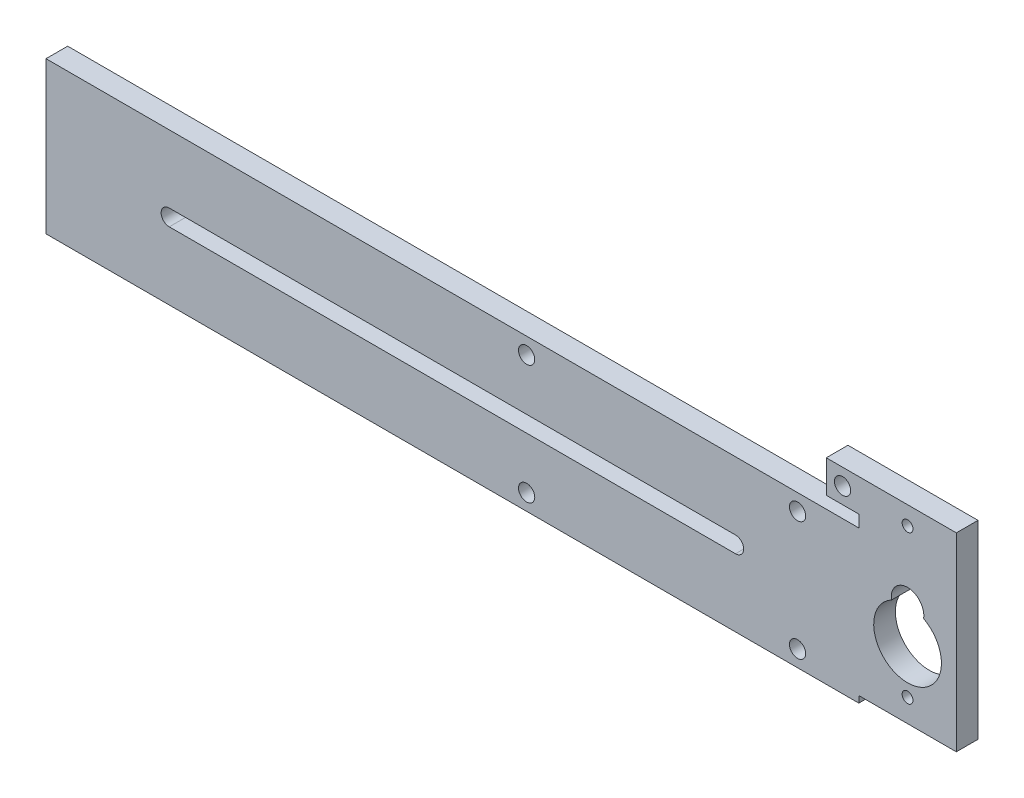
ISO-10303-21;
HEADER;
FILE_DESCRIPTION(('STEP AP214'),'2;1');
FILE_NAME('part.step','',(''),(''),'','','');
FILE_SCHEMA(('AUTOMOTIVE_DESIGN { 1 0 10303 214 1 1 1 1 }'));
ENDSEC;
DATA;
#1=APPLICATION_CONTEXT('core data for automotive mechanical design processes');
#2=APPLICATION_PROTOCOL_DEFINITION('international standard','automotive_design',2000,#1);
#3=PRODUCT_CONTEXT('',#1,'mechanical');
#4=PRODUCT('Part','Part','',(#3));
#5=PRODUCT_RELATED_PRODUCT_CATEGORY('part','',(#4));
#6=PRODUCT_DEFINITION_FORMATION('','',#4);
#7=PRODUCT_DEFINITION_CONTEXT('part definition',#1,'design');
#8=PRODUCT_DEFINITION('design','',#6,#7);
#9=PRODUCT_DEFINITION_SHAPE('','',#8);
#10=(LENGTH_UNIT() NAMED_UNIT(*) SI_UNIT(.MILLI.,.METRE.));
#11=(NAMED_UNIT(*) PLANE_ANGLE_UNIT() SI_UNIT($,.RADIAN.));
#12=(NAMED_UNIT(*) SI_UNIT($,.STERADIAN.) SOLID_ANGLE_UNIT());
#13=UNCERTAINTY_MEASURE_WITH_UNIT(LENGTH_MEASURE(1.E-05),#10,'distance_accuracy_value','');
#14=(GEOMETRIC_REPRESENTATION_CONTEXT(3) GLOBAL_UNCERTAINTY_ASSIGNED_CONTEXT((#13)) GLOBAL_UNIT_ASSIGNED_CONTEXT((#10,
#11,#12)) REPRESENTATION_CONTEXT('',''));
#15=CARTESIAN_POINT('',(0.,0.,0.));
#16=DIRECTION('',(0.,0.,1.));
#17=DIRECTION('',(1.,0.,0.));
#18=AXIS2_PLACEMENT_3D('',#15,#16,#17);
#19=CARTESIAN_POINT('',(-75.,14.,4.));
#20=DIRECTION('',(1.,0.,0.));
#21=DIRECTION('',(0.,0.,-1.));
#22=AXIS2_PLACEMENT_3D('',#19,#20,#21);
#23=PLANE('',#22);
#24=DIRECTION('',(0.,-1.,0.));
#25=VECTOR('',#24,1.);
#26=CARTESIAN_POINT('',(-75.,14.,0.));
#27=LINE('',#26,#25);
#28=CARTESIAN_POINT('',(-75.,14.,0.));
#29=VERTEX_POINT('',#28);
#30=CARTESIAN_POINT('',(-75.,-14.,0.));
#31=VERTEX_POINT('',#30);
#32=EDGE_CURVE('E315',#29,#31,#27,.T.);
#33=ORIENTED_EDGE('',*,*,#32,.T.);
#34=DIRECTION('',(0.,0.,-1.));
#35=VECTOR('',#34,1.);
#36=CARTESIAN_POINT('',(-75.,-14.,4.));
#37=LINE('',#36,#35);
#38=CARTESIAN_POINT('',(-75.,-14.,4.));
#39=VERTEX_POINT('',#38);
#40=EDGE_CURVE('E12',#39,#31,#37,.T.);
#41=ORIENTED_EDGE('',*,*,#40,.F.);
#42=DIRECTION('',(0.,-1.,0.));
#43=VECTOR('',#42,1.);
#44=CARTESIAN_POINT('',(-75.,14.,4.));
#45=LINE('',#44,#43);
#46=CARTESIAN_POINT('',(-75.,14.,4.));
#47=VERTEX_POINT('',#46);
#48=EDGE_CURVE('E296',#47,#39,#45,.T.);
#49=ORIENTED_EDGE('',*,*,#48,.F.);
#50=DIRECTION('',(0.,0.,-1.));
#51=VECTOR('',#50,1.);
#52=CARTESIAN_POINT('',(-75.,14.,4.));
#53=LINE('',#52,#51);
#54=EDGE_CURVE('E314',#47,#29,#53,.T.);
#55=ORIENTED_EDGE('',*,*,#54,.T.);
#56=EDGE_LOOP('',(#33,#41,#49,#55));
#57=FACE_BOUND('',#56,.T.);
#58=ADVANCED_FACE('F44',(#57),#23,.F.);
#59=CARTESIAN_POINT('',(-75.,-14.,4.));
#60=DIRECTION('',(0.,1.,0.));
#61=DIRECTION('',(0.,0.,1.));
#62=AXIS2_PLACEMENT_3D('',#59,#60,#61);
#63=PLANE('',#62);
#64=DIRECTION('',(1.,0.,0.));
#65=VECTOR('',#64,1.);
#66=CARTESIAN_POINT('',(-75.,-14.,0.));
#67=LINE('',#66,#65);
#68=CARTESIAN_POINT('',(75.,-14.,0.));
#69=VERTEX_POINT('',#68);
#70=EDGE_CURVE('E318',#31,#69,#67,.T.);
#71=ORIENTED_EDGE('',*,*,#70,.T.);
#72=DIRECTION('',(0.,0.,-1.));
#73=VECTOR('',#72,1.);
#74=CARTESIAN_POINT('',(75.,-14.,4.));
#75=LINE('',#74,#73);
#76=CARTESIAN_POINT('',(75.,-14.,4.));
#77=VERTEX_POINT('',#76);
#78=EDGE_CURVE('E51',#77,#69,#75,.T.);
#79=ORIENTED_EDGE('',*,*,#78,.F.);
#80=DIRECTION('',(1.,0.,0.));
#81=VECTOR('',#80,1.);
#82=CARTESIAN_POINT('',(-75.,-14.,4.));
#83=LINE('',#82,#81);
#84=EDGE_CURVE('E300',#39,#77,#83,.T.);
#85=ORIENTED_EDGE('',*,*,#84,.F.);
#86=ORIENTED_EDGE('',*,*,#40,.T.);
#87=EDGE_LOOP('',(#71,#79,#85,#86));
#88=FACE_BOUND('',#87,.T.);
#89=ADVANCED_FACE('F333',(#88),#63,.F.);
#90=CARTESIAN_POINT('',(75.,14.,4.));
#91=DIRECTION('',(1.,0.,0.));
#92=DIRECTION('',(0.,0.,-1.));
#93=AXIS2_PLACEMENT_3D('',#90,#91,#92);
#94=PLANE('',#93);
#95=DIRECTION('',(0.,0.,-1.));
#96=VECTOR('',#95,1.);
#97=CARTESIAN_POINT('',(75.,-12.7852836570863,43.3573373083089));
#98=LINE('',#97,#96);
#99=CARTESIAN_POINT('',(75.,-12.7852836570863,4.));
#100=VERTEX_POINT('',#99);
#101=CARTESIAN_POINT('',(75.,-12.7852836570863,0.));
#102=VERTEX_POINT('',#101);
#103=EDGE_CURVE('E66',#100,#102,#98,.T.);
#104=ORIENTED_EDGE('',*,*,#103,.F.);
#105=DIRECTION('',(0.,-1.,0.));
#106=VECTOR('',#105,1.);
#107=CARTESIAN_POINT('',(75.,14.,4.));
#108=LINE('',#107,#106);
#109=EDGE_CURVE('E306',#100,#77,#108,.T.);
#110=ORIENTED_EDGE('',*,*,#109,.T.);
#111=ORIENTED_EDGE('',*,*,#78,.T.);
#112=DIRECTION('',(0.,-1.,0.));
#113=VECTOR('',#112,1.);
#114=CARTESIAN_POINT('',(75.,14.,0.));
#115=LINE('',#114,#113);
#116=EDGE_CURVE('E322',#102,#69,#115,.T.);
#117=ORIENTED_EDGE('',*,*,#116,.F.);
#118=EDGE_LOOP('',(#104,#110,#111,#117));
#119=FACE_BOUND('',#118,.T.);
#120=ADVANCED_FACE('F331',(#119),#94,.T.);
#121=CARTESIAN_POINT('',(-75.,14.,4.));
#122=DIRECTION('',(0.,1.,0.));
#123=DIRECTION('',(0.,0.,1.));
#124=AXIS2_PLACEMENT_3D('',#121,#122,#123);
#125=PLANE('',#124);
#126=DIRECTION('',(1.,0.,0.));
#127=VECTOR('',#126,1.);
#128=CARTESIAN_POINT('',(-75.,14.,0.));
#129=LINE('',#128,#127);
#130=CARTESIAN_POINT('',(75.,14.,0.));
#131=VERTEX_POINT('',#130);
#132=EDGE_CURVE('E301',#29,#131,#129,.T.);
#133=ORIENTED_EDGE('',*,*,#132,.F.);
#134=ORIENTED_EDGE('',*,*,#54,.F.);
#135=DIRECTION('',(1.,0.,0.));
#136=VECTOR('',#135,1.);
#137=CARTESIAN_POINT('',(-75.,14.,4.));
#138=LINE('',#137,#136);
#139=CARTESIAN_POINT('',(75.,14.,4.));
#140=VERTEX_POINT('',#139);
#141=EDGE_CURVE('E309',#47,#140,#138,.T.);
#142=ORIENTED_EDGE('',*,*,#141,.T.);
#143=DIRECTION('',(0.,0.,-1.));
#144=VECTOR('',#143,1.);
#145=CARTESIAN_POINT('',(75.,14.,4.));
#146=LINE('',#145,#144);
#147=EDGE_CURVE('E327',#140,#131,#146,.T.);
#148=ORIENTED_EDGE('',*,*,#147,.T.);
#149=EDGE_LOOP('',(#133,#134,#142,#148));
#150=FACE_BOUND('',#149,.T.);
#151=ADVANCED_FACE('F390',(#150),#125,.T.);
#152=CARTESIAN_POINT('',(0.,0.,4.));
#153=DIRECTION('',(0.,0.,1.));
#154=DIRECTION('',(1.,0.,0.));
#155=AXIS2_PLACEMENT_3D('',#152,#153,#154);
#156=PLANE('',#155);
#157=CARTESIAN_POINT('',(13.6991032148638,11.0037655044453,4.));
#158=DIRECTION('',(0.,0.,1.));
#159=DIRECTION('',(-1.,0.,0.));
#160=AXIS2_PLACEMENT_3D('',#157,#158,#159);
#161=CIRCLE('',#160,1.5);
#162=CARTESIAN_POINT('',(12.1991032148638,11.0037655044453,4.));
#163=VERTEX_POINT('',#162);
#164=EDGE_CURVE('E621',#163,#163,#161,.T.);
#165=ORIENTED_EDGE('',*,*,#164,.F.);
#166=EDGE_LOOP('',(#165));
#167=FACE_BOUND('',#166,.T.);
#168=CARTESIAN_POINT('',(63.6991032148638,11.0037655044453,4.));
#169=DIRECTION('',(0.,0.,1.));
#170=DIRECTION('',(-1.,0.,0.));
#171=AXIS2_PLACEMENT_3D('',#168,#169,#170);
#172=CIRCLE('',#171,1.5);
#173=CARTESIAN_POINT('',(62.1991032148638,11.0037655044453,4.));
#174=VERTEX_POINT('',#173);
#175=EDGE_CURVE('E629',#174,#174,#172,.T.);
#176=ORIENTED_EDGE('',*,*,#175,.F.);
#177=EDGE_LOOP('',(#176));
#178=FACE_BOUND('',#177,.T.);
#179=CARTESIAN_POINT('',(63.6991032148638,-11.0037655044453,4.));
#180=DIRECTION('',(0.,0.,1.));
#181=DIRECTION('',(1.,0.,0.));
#182=AXIS2_PLACEMENT_3D('',#179,#180,#181);
#183=CIRCLE('',#182,1.5);
#184=CARTESIAN_POINT('',(65.1991032148638,-11.0037655044453,4.));
#185=VERTEX_POINT('',#184);
#186=EDGE_CURVE('E245',#185,#185,#183,.T.);
#187=ORIENTED_EDGE('',*,*,#186,.F.);
#188=EDGE_LOOP('',(#187));
#189=FACE_BOUND('',#188,.T.);
#190=CARTESIAN_POINT('',(13.6991032148638,-11.0037655044453,4.));
#191=DIRECTION('',(0.,0.,1.));
#192=DIRECTION('',(1.,0.,0.));
#193=AXIS2_PLACEMENT_3D('',#190,#191,#192);
#194=CIRCLE('',#193,1.5);
#195=CARTESIAN_POINT('',(15.1991032148638,-11.0037655044453,4.));
#196=VERTEX_POINT('',#195);
#197=EDGE_CURVE('E244',#196,#196,#194,.T.);
#198=ORIENTED_EDGE('',*,*,#197,.F.);
#199=EDGE_LOOP('',(#198));
#200=FACE_BOUND('',#199,.T.);
#201=CARTESIAN_POINT('',(-52.2515345705721,0.,4.));
#202=DIRECTION('',(0.,0.,1.));
#203=DIRECTION('',(1.,0.,0.));
#204=AXIS2_PLACEMENT_3D('',#201,#202,#203);
#205=CIRCLE('',#204,1.50000000000002);
#206=CARTESIAN_POINT('',(-52.2515345705721,1.50000000000002,4.));
#207=VERTEX_POINT('',#206);
#208=CARTESIAN_POINT('',(-52.2515345705721,-1.50000000000002,4.));
#209=VERTEX_POINT('',#208);
#210=EDGE_CURVE('E279',#207,#209,#205,.T.);
#211=ORIENTED_EDGE('',*,*,#210,.F.);
#212=DIRECTION('',(1.,0.,0.));
#213=VECTOR('',#212,1.);
#214=CARTESIAN_POINT('',(-52.2515345705721,1.50000000000002,4.));
#215=LINE('',#214,#213);
#216=CARTESIAN_POINT('',(52.2515345705721,1.50000000000002,4.));
#217=VERTEX_POINT('',#216);
#218=EDGE_CURVE('E271',#207,#217,#215,.T.);
#219=ORIENTED_EDGE('',*,*,#218,.T.);
#220=CARTESIAN_POINT('',(52.2515345705721,0.,4.));
#221=DIRECTION('',(0.,0.,1.));
#222=DIRECTION('',(1.,0.,0.));
#223=AXIS2_PLACEMENT_3D('',#220,#221,#222);
#224=CIRCLE('',#223,1.50000000000002);
#225=CARTESIAN_POINT('',(52.2515345705721,-1.5,4.));
#226=VERTEX_POINT('',#225);
#227=EDGE_CURVE('E288',#226,#217,#224,.T.);
#228=ORIENTED_EDGE('',*,*,#227,.F.);
#229=DIRECTION('',(1.,0.,0.));
#230=VECTOR('',#229,1.);
#231=CARTESIAN_POINT('',(-52.2515345705721,-1.50000000000002,4.));
#232=LINE('',#231,#230);
#233=EDGE_CURVE('E283',#209,#226,#232,.T.);
#234=ORIENTED_EDGE('',*,*,#233,.F.);
#235=EDGE_LOOP('',(#211,#219,#228,#234));
#236=FACE_BOUND('',#235,.T.);
#237=ORIENTED_EDGE('',*,*,#48,.T.);
#238=ORIENTED_EDGE('',*,*,#84,.T.);
#239=ORIENTED_EDGE('',*,*,#109,.F.);
#240=DIRECTION('',(1.,0.,0.));
#241=VECTOR('',#240,1.);
#242=CARTESIAN_POINT('',(0.,-12.7852836570863,4.));
#243=LINE('',#242,#241);
#244=CARTESIAN_POINT('',(93.,-12.7852836570863,4.));
#245=VERTEX_POINT('',#244);
#246=EDGE_CURVE('E215',#100,#245,#243,.T.);
#247=ORIENTED_EDGE('',*,*,#246,.T.);
#248=DIRECTION('',(0.,1.,0.));
#249=VECTOR('',#248,1.);
#250=CARTESIAN_POINT('',(93.,0.,4.));
#251=LINE('',#250,#249);
#252=CARTESIAN_POINT('',(93.,22.2147163429137,4.00000000000002));
#253=VERTEX_POINT('',#252);
#254=EDGE_CURVE('E205',#245,#253,#251,.T.);
#255=ORIENTED_EDGE('',*,*,#254,.T.);
#256=DIRECTION('',(1.,0.,0.));
#257=VECTOR('',#256,1.);
#258=CARTESIAN_POINT('',(0.,22.2147163429137,4.));
#259=LINE('',#258,#257);
#260=CARTESIAN_POINT('',(69.,22.2147163429137,4.));
#261=VERTEX_POINT('',#260);
#262=EDGE_CURVE('E180',#261,#253,#259,.T.);
#263=ORIENTED_EDGE('',*,*,#262,.F.);
#264=DIRECTION('',(0.,-1.,0.));
#265=VECTOR('',#264,1.);
#266=CARTESIAN_POINT('',(69.,22.2147163429137,4.));
#267=LINE('',#266,#265);
#268=CARTESIAN_POINT('',(69.,16.2147163429137,4.));
#269=VERTEX_POINT('',#268);
#270=EDGE_CURVE('E163',#261,#269,#267,.T.);
#271=ORIENTED_EDGE('',*,*,#270,.T.);
#272=DIRECTION('',(1.,0.,0.));
#273=VECTOR('',#272,1.);
#274=CARTESIAN_POINT('',(75.,16.2147163429137,4.));
#275=LINE('',#274,#273);
#276=CARTESIAN_POINT('',(75.,16.2147163429137,4.));
#277=VERTEX_POINT('',#276);
#278=EDGE_CURVE('E169',#269,#277,#275,.T.);
#279=ORIENTED_EDGE('',*,*,#278,.T.);
#280=DIRECTION('',(0.,-1.,0.));
#281=VECTOR('',#280,1.);
#282=CARTESIAN_POINT('',(75.,0.,4.));
#283=LINE('',#282,#281);
#284=EDGE_CURVE('E58',#277,#140,#283,.T.);
#285=ORIENTED_EDGE('',*,*,#284,.T.);
#286=ORIENTED_EDGE('',*,*,#141,.F.);
#287=EDGE_LOOP('',(#237,#238,#239,#247,#255,#263,#271,#279,#285,#286));
#288=FACE_BOUND('',#287,.T.);
#289=CARTESIAN_POINT('',(84.,18.825,4.));
#290=DIRECTION('',(0.,0.,1.));
#291=DIRECTION('',(1.,0.,0.));
#292=AXIS2_PLACEMENT_3D('',#289,#290,#291);
#293=CIRCLE('',#292,0.999999999975657);
#294=CARTESIAN_POINT('',(83.0000000000243,18.825,4.));
#295=VERTEX_POINT('',#294);
#296=EDGE_CURVE('E226',#295,#295,#293,.F.);
#297=ORIENTED_EDGE('',*,*,#296,.T.);
#298=EDGE_LOOP('',(#297));
#299=FACE_BOUND('',#298,.T.);
#300=CARTESIAN_POINT('',(84.,-8.57500000000002,4.));
#301=DIRECTION('',(0.,0.,1.));
#302=DIRECTION('',(1.,0.,0.));
#303=AXIS2_PLACEMENT_3D('',#300,#301,#302);
#304=CIRCLE('',#303,0.999999999975657);
#305=CARTESIAN_POINT('',(83.0000000000243,-8.57500000000002,4.));
#306=VERTEX_POINT('',#305);
#307=EDGE_CURVE('E204',#306,#306,#304,.F.);
#308=ORIENTED_EDGE('',*,*,#307,.T.);
#309=EDGE_LOOP('',(#308));
#310=FACE_BOUND('',#309,.T.);
#311=CARTESIAN_POINT('',(84.,0.,4.));
#312=DIRECTION('',(0.,0.,1.));
#313=DIRECTION('',(1.,0.,0.));
#314=AXIS2_PLACEMENT_3D('',#311,#312,#313);
#315=CIRCLE('',#314,6.25);
#316=CARTESIAN_POINT('',(86.958915545702,5.50520833333332,4.00000000000002));
#317=VERTEX_POINT('',#316);
#318=CARTESIAN_POINT('',(81.0410844542979,5.50520833333332,4.));
#319=VERTEX_POINT('',#318);
#320=EDGE_CURVE('E216',#317,#319,#315,.F.);
#321=ORIENTED_EDGE('',*,*,#320,.T.);
#322=CARTESIAN_POINT('',(84.,5.99999999999999,4.));
#323=DIRECTION('',(0.,0.,1.));
#324=DIRECTION('',(1.,0.,0.));
#325=AXIS2_PLACEMENT_3D('',#322,#323,#324);
#326=CIRCLE('',#325,3.00000000000001);
#327=EDGE_CURVE('E206',#319,#317,#326,.F.);
#328=ORIENTED_EDGE('',*,*,#327,.T.);
#329=EDGE_LOOP('',(#321,#328));
#330=FACE_BOUND('',#329,.T.);
#331=CARTESIAN_POINT('',(72.,19.2147163429137,4.));
#332=DIRECTION('',(0.,0.,1.));
#333=DIRECTION('',(1.,0.,0.));
#334=AXIS2_PLACEMENT_3D('',#331,#332,#333);
#335=CIRCLE('',#334,1.5);
#336=CARTESIAN_POINT('',(73.5,19.2147163429137,4.));
#337=VERTEX_POINT('',#336);
#338=EDGE_CURVE('E183',#337,#337,#335,.T.);
#339=ORIENTED_EDGE('',*,*,#338,.F.);
#340=EDGE_LOOP('',(#339));
#341=FACE_BOUND('',#340,.T.);
#342=ADVANCED_FACE('F177',(#167,#178,#189,#200,#236,#288,#299,#310,#330,#341),#156,.T.);
#343=CARTESIAN_POINT('',(0.,0.,0.));
#344=DIRECTION('',(0.,0.,1.));
#345=DIRECTION('',(1.,0.,0.));
#346=AXIS2_PLACEMENT_3D('',#343,#344,#345);
#347=PLANE('',#346);
#348=CARTESIAN_POINT('',(13.6991032148638,11.0037655044453,0.));
#349=DIRECTION('',(0.,0.,1.));
#350=DIRECTION('',(-1.,0.,0.));
#351=AXIS2_PLACEMENT_3D('',#348,#349,#350);
#352=CIRCLE('',#351,1.5);
#353=CARTESIAN_POINT('',(12.1991032148638,11.0037655044453,0.));
#354=VERTEX_POINT('',#353);
#355=EDGE_CURVE('E624',#354,#354,#352,.T.);
#356=ORIENTED_EDGE('',*,*,#355,.T.);
#357=EDGE_LOOP('',(#356));
#358=FACE_BOUND('',#357,.T.);
#359=CARTESIAN_POINT('',(63.6991032148638,11.0037655044453,0.));
#360=DIRECTION('',(0.,0.,1.));
#361=DIRECTION('',(-1.,0.,0.));
#362=AXIS2_PLACEMENT_3D('',#359,#360,#361);
#363=CIRCLE('',#362,1.5);
#364=CARTESIAN_POINT('',(62.1991032148638,11.0037655044453,0.));
#365=VERTEX_POINT('',#364);
#366=EDGE_CURVE('E250',#365,#365,#363,.T.);
#367=ORIENTED_EDGE('',*,*,#366,.T.);
#368=EDGE_LOOP('',(#367));
#369=FACE_BOUND('',#368,.T.);
#370=CARTESIAN_POINT('',(63.6991032148638,-11.0037655044453,0.));
#371=DIRECTION('',(0.,0.,1.));
#372=DIRECTION('',(1.,0.,0.));
#373=AXIS2_PLACEMENT_3D('',#370,#371,#372);
#374=CIRCLE('',#373,1.5);
#375=CARTESIAN_POINT('',(65.1991032148638,-11.0037655044453,0.));
#376=VERTEX_POINT('',#375);
#377=EDGE_CURVE('E241',#376,#376,#374,.T.);
#378=ORIENTED_EDGE('',*,*,#377,.T.);
#379=EDGE_LOOP('',(#378));
#380=FACE_BOUND('',#379,.T.);
#381=CARTESIAN_POINT('',(13.6991032148638,-11.0037655044453,0.));
#382=DIRECTION('',(0.,0.,1.));
#383=DIRECTION('',(1.,0.,0.));
#384=AXIS2_PLACEMENT_3D('',#381,#382,#383);
#385=CIRCLE('',#384,1.5);
#386=CARTESIAN_POINT('',(15.1991032148638,-11.0037655044453,0.));
#387=VERTEX_POINT('',#386);
#388=EDGE_CURVE('E265',#387,#387,#385,.T.);
#389=ORIENTED_EDGE('',*,*,#388,.T.);
#390=EDGE_LOOP('',(#389));
#391=FACE_BOUND('',#390,.T.);
#392=DIRECTION('',(1.,0.,0.));
#393=VECTOR('',#392,1.);
#394=CARTESIAN_POINT('',(-52.2515345705721,1.50000000000002,0.));
#395=LINE('',#394,#393);
#396=CARTESIAN_POINT('',(-52.2515345705721,1.50000000000002,0.));
#397=VERTEX_POINT('',#396);
#398=CARTESIAN_POINT('',(52.2515345705721,1.50000000000002,0.));
#399=VERTEX_POINT('',#398);
#400=EDGE_CURVE('E277',#397,#399,#395,.T.);
#401=ORIENTED_EDGE('',*,*,#400,.F.);
#402=CARTESIAN_POINT('',(-52.2515345705721,0.,0.));
#403=DIRECTION('',(0.,0.,1.));
#404=DIRECTION('',(1.,0.,0.));
#405=AXIS2_PLACEMENT_3D('',#402,#403,#404);
#406=CIRCLE('',#405,1.50000000000002);
#407=CARTESIAN_POINT('',(-52.2515345705721,-1.50000000000002,0.));
#408=VERTEX_POINT('',#407);
#409=EDGE_CURVE('E267',#397,#408,#406,.T.);
#410=ORIENTED_EDGE('',*,*,#409,.T.);
#411=DIRECTION('',(1.,0.,0.));
#412=VECTOR('',#411,1.);
#413=CARTESIAN_POINT('',(-52.2515345705721,-1.50000000000002,0.));
#414=LINE('',#413,#412);
#415=CARTESIAN_POINT('',(52.2515345705721,-1.5,0.));
#416=VERTEX_POINT('',#415);
#417=EDGE_CURVE('E270',#408,#416,#414,.T.);
#418=ORIENTED_EDGE('',*,*,#417,.T.);
#419=CARTESIAN_POINT('',(52.2515345705721,0.,0.));
#420=DIRECTION('',(0.,0.,1.));
#421=DIRECTION('',(1.,0.,0.));
#422=AXIS2_PLACEMENT_3D('',#419,#420,#421);
#423=CIRCLE('',#422,1.50000000000002);
#424=EDGE_CURVE('E274',#416,#399,#423,.T.);
#425=ORIENTED_EDGE('',*,*,#424,.T.);
#426=EDGE_LOOP('',(#401,#410,#418,#425));
#427=FACE_BOUND('',#426,.T.);
#428=ORIENTED_EDGE('',*,*,#32,.F.);
#429=ORIENTED_EDGE('',*,*,#132,.T.);
#430=DIRECTION('',(0.,-1.,0.));
#431=VECTOR('',#430,1.);
#432=CARTESIAN_POINT('',(75.,0.,0.));
#433=LINE('',#432,#431);
#434=CARTESIAN_POINT('',(75.,16.2147163429137,0.));
#435=VERTEX_POINT('',#434);
#436=EDGE_CURVE('E228',#435,#131,#433,.T.);
#437=ORIENTED_EDGE('',*,*,#436,.F.);
#438=DIRECTION('',(-1.,0.,0.));
#439=VECTOR('',#438,1.);
#440=CARTESIAN_POINT('',(75.,16.2147163429137,0.));
#441=LINE('',#440,#439);
#442=CARTESIAN_POINT('',(69.,16.2147163429137,0.));
#443=VERTEX_POINT('',#442);
#444=EDGE_CURVE('E391',#435,#443,#441,.T.);
#445=ORIENTED_EDGE('',*,*,#444,.T.);
#446=DIRECTION('',(0.,1.,0.));
#447=VECTOR('',#446,1.);
#448=CARTESIAN_POINT('',(69.,22.2147163429137,0.));
#449=LINE('',#448,#447);
#450=CARTESIAN_POINT('',(69.,22.2147163429137,0.));
#451=VERTEX_POINT('',#450);
#452=EDGE_CURVE('E165',#443,#451,#449,.T.);
#453=ORIENTED_EDGE('',*,*,#452,.T.);
#454=DIRECTION('',(1.,0.,0.));
#455=VECTOR('',#454,1.);
#456=CARTESIAN_POINT('',(0.,22.2147163429137,0.));
#457=LINE('',#456,#455);
#458=CARTESIAN_POINT('',(93.,22.2147163429137,0.));
#459=VERTEX_POINT('',#458);
#460=EDGE_CURVE('E346',#451,#459,#457,.T.);
#461=ORIENTED_EDGE('',*,*,#460,.T.);
#462=DIRECTION('',(0.,1.,0.));
#463=VECTOR('',#462,1.);
#464=CARTESIAN_POINT('',(93.,0.,0.));
#465=LINE('',#464,#463);
#466=CARTESIAN_POINT('',(93.,-12.7852836570863,0.));
#467=VERTEX_POINT('',#466);
#468=EDGE_CURVE('E211',#467,#459,#465,.T.);
#469=ORIENTED_EDGE('',*,*,#468,.F.);
#470=DIRECTION('',(1.,0.,0.));
#471=VECTOR('',#470,1.);
#472=CARTESIAN_POINT('',(0.,-12.7852836570863,0.));
#473=LINE('',#472,#471);
#474=EDGE_CURVE('E230',#102,#467,#473,.T.);
#475=ORIENTED_EDGE('',*,*,#474,.F.);
#476=ORIENTED_EDGE('',*,*,#116,.T.);
#477=ORIENTED_EDGE('',*,*,#70,.F.);
#478=EDGE_LOOP('',(#428,#429,#437,#445,#453,#461,#469,#475,#476,#477));
#479=FACE_BOUND('',#478,.T.);
#480=CARTESIAN_POINT('',(84.,18.825,0.));
#481=DIRECTION('',(0.,0.,-1.));
#482=DIRECTION('',(-1.,0.,0.));
#483=AXIS2_PLACEMENT_3D('',#480,#481,#482);
#484=CIRCLE('',#483,0.999999999975657);
#485=CARTESIAN_POINT('',(83.0000000000243,18.825,0.));
#486=VERTEX_POINT('',#485);
#487=EDGE_CURVE('E231',#486,#486,#484,.T.);
#488=ORIENTED_EDGE('',*,*,#487,.F.);
#489=EDGE_LOOP('',(#488));
#490=FACE_BOUND('',#489,.T.);
#491=CARTESIAN_POINT('',(84.,-8.57500000000002,0.));
#492=DIRECTION('',(0.,0.,-1.));
#493=DIRECTION('',(-1.,0.,0.));
#494=AXIS2_PLACEMENT_3D('',#491,#492,#493);
#495=CIRCLE('',#494,0.999999999975657);
#496=CARTESIAN_POINT('',(83.0000000000243,-8.57500000000002,0.));
#497=VERTEX_POINT('',#496);
#498=EDGE_CURVE('E354',#497,#497,#495,.T.);
#499=ORIENTED_EDGE('',*,*,#498,.F.);
#500=EDGE_LOOP('',(#499));
#501=FACE_BOUND('',#500,.T.);
#502=CARTESIAN_POINT('',(84.,5.99999999999999,0.));
#503=DIRECTION('',(0.,0.,-1.));
#504=DIRECTION('',(-1.,0.,0.));
#505=AXIS2_PLACEMENT_3D('',#502,#503,#504);
#506=CIRCLE('',#505,3.00000000000001);
#507=CARTESIAN_POINT('',(81.0410844542979,5.50520833333332,0.));
#508=VERTEX_POINT('',#507);
#509=CARTESIAN_POINT('',(86.958915545702,5.50520833333332,0.));
#510=VERTEX_POINT('',#509);
#511=EDGE_CURVE('E238',#508,#510,#506,.T.);
#512=ORIENTED_EDGE('',*,*,#511,.F.);
#513=CARTESIAN_POINT('',(84.,0.,0.));
#514=DIRECTION('',(0.,0.,-1.));
#515=DIRECTION('',(-1.,0.,0.));
#516=AXIS2_PLACEMENT_3D('',#513,#514,#515);
#517=CIRCLE('',#516,6.25);
#518=EDGE_CURVE('E237',#510,#508,#517,.T.);
#519=ORIENTED_EDGE('',*,*,#518,.F.);
#520=EDGE_LOOP('',(#512,#519));
#521=FACE_BOUND('',#520,.T.);
#522=CARTESIAN_POINT('',(72.,19.2147163429137,0.));
#523=DIRECTION('',(0.,0.,1.));
#524=DIRECTION('',(1.,0.,0.));
#525=AXIS2_PLACEMENT_3D('',#522,#523,#524);
#526=CIRCLE('',#525,1.5);
#527=CARTESIAN_POINT('',(73.5,19.2147163429137,0.));
#528=VERTEX_POINT('',#527);
#529=EDGE_CURVE('E234',#528,#528,#526,.F.);
#530=ORIENTED_EDGE('',*,*,#529,.F.);
#531=EDGE_LOOP('',(#530));
#532=FACE_BOUND('',#531,.T.);
#533=ADVANCED_FACE('F337',(#358,#369,#380,#391,#427,#479,#490,#501,#521,#532),#347,.F.);
#534=CARTESIAN_POINT('',(-52.2515345705721,0.,0.));
#535=DIRECTION('',(0.,0.,1.));
#536=DIRECTION('',(1.,0.,0.));
#537=AXIS2_PLACEMENT_3D('',#534,#535,#536);
#538=CYLINDRICAL_SURFACE('',#537,1.50000000000002);
#539=ORIENTED_EDGE('',*,*,#210,.T.);
#540=DIRECTION('',(0.,0.,1.));
#541=VECTOR('',#540,1.);
#542=CARTESIAN_POINT('',(-52.2515345705721,-1.50000000000002,0.));
#543=LINE('',#542,#541);
#544=EDGE_CURVE('E278',#408,#209,#543,.T.);
#545=ORIENTED_EDGE('',*,*,#544,.F.);
#546=ORIENTED_EDGE('',*,*,#409,.F.);
#547=DIRECTION('',(0.,0.,1.));
#548=VECTOR('',#547,1.);
#549=CARTESIAN_POINT('',(-52.2515345705721,1.50000000000002,0.));
#550=LINE('',#549,#548);
#551=EDGE_CURVE('E319',#397,#207,#550,.T.);
#552=ORIENTED_EDGE('',*,*,#551,.T.);
#553=EDGE_LOOP('',(#539,#545,#546,#552));
#554=FACE_BOUND('',#553,.T.);
#555=ADVANCED_FACE('F434',(#554),#538,.F.);
#556=CARTESIAN_POINT('',(-52.2515345705721,1.50000000000002,0.));
#557=DIRECTION('',(0.,-1.,0.));
#558=DIRECTION('',(1.,0.,0.));
#559=AXIS2_PLACEMENT_3D('',#556,#557,#558);
#560=PLANE('',#559);
#561=ORIENTED_EDGE('',*,*,#218,.F.);
#562=ORIENTED_EDGE('',*,*,#551,.F.);
#563=ORIENTED_EDGE('',*,*,#400,.T.);
#564=DIRECTION('',(0.,0.,1.));
#565=VECTOR('',#564,1.);
#566=CARTESIAN_POINT('',(52.2515345705721,1.50000000000002,0.));
#567=LINE('',#566,#565);
#568=EDGE_CURVE('E649',#399,#217,#567,.T.);
#569=ORIENTED_EDGE('',*,*,#568,.T.);
#570=EDGE_LOOP('',(#561,#562,#563,#569));
#571=FACE_BOUND('',#570,.T.);
#572=ADVANCED_FACE('F430',(#571),#560,.T.);
#573=CARTESIAN_POINT('',(52.2515345705721,0.,0.));
#574=DIRECTION('',(0.,0.,1.));
#575=DIRECTION('',(1.,0.,0.));
#576=AXIS2_PLACEMENT_3D('',#573,#574,#575);
#577=CYLINDRICAL_SURFACE('',#576,1.50000000000002);
#578=ORIENTED_EDGE('',*,*,#227,.T.);
#579=ORIENTED_EDGE('',*,*,#568,.F.);
#580=ORIENTED_EDGE('',*,*,#424,.F.);
#581=DIRECTION('',(0.,0.,1.));
#582=VECTOR('',#581,1.);
#583=CARTESIAN_POINT('',(52.2515345705721,-1.5,0.));
#584=LINE('',#583,#582);
#585=EDGE_CURVE('E654',#416,#226,#584,.T.);
#586=ORIENTED_EDGE('',*,*,#585,.T.);
#587=EDGE_LOOP('',(#578,#579,#580,#586));
#588=FACE_BOUND('',#587,.T.);
#589=ADVANCED_FACE('F433',(#588),#577,.F.);
#590=CARTESIAN_POINT('',(-52.2515345705721,-1.50000000000002,0.));
#591=DIRECTION('',(0.,-1.,0.));
#592=DIRECTION('',(1.,0.,0.));
#593=AXIS2_PLACEMENT_3D('',#590,#591,#592);
#594=PLANE('',#593);
#595=ORIENTED_EDGE('',*,*,#233,.T.);
#596=ORIENTED_EDGE('',*,*,#585,.F.);
#597=ORIENTED_EDGE('',*,*,#417,.F.);
#598=ORIENTED_EDGE('',*,*,#544,.T.);
#599=EDGE_LOOP('',(#595,#596,#597,#598));
#600=FACE_BOUND('',#599,.T.);
#601=ADVANCED_FACE('F428',(#600),#594,.F.);
#602=CARTESIAN_POINT('',(13.6991032148638,-11.0037655044453,0.));
#603=DIRECTION('',(0.,0.,1.));
#604=DIRECTION('',(1.,0.,0.));
#605=AXIS2_PLACEMENT_3D('',#602,#603,#604);
#606=CYLINDRICAL_SURFACE('',#605,1.5);
#607=ORIENTED_EDGE('',*,*,#388,.F.);
#608=EDGE_LOOP('',(#607));
#609=FACE_BOUND('',#608,.T.);
#610=ORIENTED_EDGE('',*,*,#197,.T.);
#611=EDGE_LOOP('',(#610));
#612=FACE_BOUND('',#611,.T.);
#613=ADVANCED_FACE('F421',(#609,#612),#606,.F.);
#614=CARTESIAN_POINT('',(63.6991032148638,-11.0037655044453,0.));
#615=DIRECTION('',(0.,0.,1.));
#616=DIRECTION('',(1.,0.,0.));
#617=AXIS2_PLACEMENT_3D('',#614,#615,#616);
#618=CYLINDRICAL_SURFACE('',#617,1.5);
#619=ORIENTED_EDGE('',*,*,#377,.F.);
#620=EDGE_LOOP('',(#619));
#621=FACE_BOUND('',#620,.T.);
#622=ORIENTED_EDGE('',*,*,#186,.T.);
#623=EDGE_LOOP('',(#622));
#624=FACE_BOUND('',#623,.T.);
#625=ADVANCED_FACE('F418',(#621,#624),#618,.F.);
#626=CARTESIAN_POINT('',(63.6991032148638,11.0037655044453,0.));
#627=DIRECTION('',(0.,0.,1.));
#628=DIRECTION('',(1.,0.,0.));
#629=AXIS2_PLACEMENT_3D('',#626,#627,#628);
#630=CYLINDRICAL_SURFACE('',#629,1.5);
#631=ORIENTED_EDGE('',*,*,#366,.F.);
#632=EDGE_LOOP('',(#631));
#633=FACE_BOUND('',#632,.T.);
#634=ORIENTED_EDGE('',*,*,#175,.T.);
#635=EDGE_LOOP('',(#634));
#636=FACE_BOUND('',#635,.T.);
#637=ADVANCED_FACE('F413',(#633,#636),#630,.F.);
#638=CARTESIAN_POINT('',(13.6991032148638,11.0037655044453,0.));
#639=DIRECTION('',(0.,0.,1.));
#640=DIRECTION('',(1.,0.,0.));
#641=AXIS2_PLACEMENT_3D('',#638,#639,#640);
#642=CYLINDRICAL_SURFACE('',#641,1.5);
#643=ORIENTED_EDGE('',*,*,#355,.F.);
#644=EDGE_LOOP('',(#643));
#645=FACE_BOUND('',#644,.T.);
#646=ORIENTED_EDGE('',*,*,#164,.T.);
#647=EDGE_LOOP('',(#646));
#648=FACE_BOUND('',#647,.T.);
#649=ADVANCED_FACE('F406',(#645,#648),#642,.F.);
#650=CARTESIAN_POINT('',(93.,0.,43.3573373083089));
#651=DIRECTION('',(-1.,0.,0.));
#652=DIRECTION('',(0.,0.,1.));
#653=AXIS2_PLACEMENT_3D('',#650,#651,#652);
#654=PLANE('',#653);
#655=ORIENTED_EDGE('',*,*,#254,.F.);
#656=DIRECTION('',(0.,0.,-1.));
#657=VECTOR('',#656,1.);
#658=CARTESIAN_POINT('',(93.,-12.7852836570863,43.3573373083089));
#659=LINE('',#658,#657);
#660=EDGE_CURVE('E232',#245,#467,#659,.T.);
#661=ORIENTED_EDGE('',*,*,#660,.T.);
#662=ORIENTED_EDGE('',*,*,#468,.T.);
#663=DIRECTION('',(0.,0.,-1.));
#664=VECTOR('',#663,1.);
#665=CARTESIAN_POINT('',(93.,22.2147163429137,43.3573373083089));
#666=LINE('',#665,#664);
#667=EDGE_CURVE('E210',#253,#459,#666,.T.);
#668=ORIENTED_EDGE('',*,*,#667,.F.);
#669=EDGE_LOOP('',(#655,#661,#662,#668));
#670=FACE_BOUND('',#669,.T.);
#671=ADVANCED_FACE('F403',(#670),#654,.F.);
#672=CARTESIAN_POINT('',(0.,22.2147163429137,43.3573373083089));
#673=DIRECTION('',(0.,1.,0.));
#674=DIRECTION('',(-1.,0.,0.));
#675=AXIS2_PLACEMENT_3D('',#672,#673,#674);
#676=PLANE('',#675);
#677=ORIENTED_EDGE('',*,*,#460,.F.);
#678=DIRECTION('',(0.,0.,1.));
#679=VECTOR('',#678,1.);
#680=CARTESIAN_POINT('',(69.,22.2147163429137,-8.48528137423857));
#681=LINE('',#680,#679);
#682=EDGE_CURVE('E393',#451,#261,#681,.T.);
#683=ORIENTED_EDGE('',*,*,#682,.T.);
#684=ORIENTED_EDGE('',*,*,#262,.T.);
#685=ORIENTED_EDGE('',*,*,#667,.T.);
#686=EDGE_LOOP('',(#677,#683,#684,#685));
#687=FACE_BOUND('',#686,.T.);
#688=ADVANCED_FACE('F399',(#687),#676,.T.);
#689=CARTESIAN_POINT('',(75.,0.,43.3573373083089));
#690=DIRECTION('',(1.,0.,0.));
#691=DIRECTION('',(0.,0.,-1.));
#692=AXIS2_PLACEMENT_3D('',#689,#690,#691);
#693=PLANE('',#692);
#694=ORIENTED_EDGE('',*,*,#284,.F.);
#695=DIRECTION('',(0.,0.,1.));
#696=VECTOR('',#695,1.);
#697=CARTESIAN_POINT('',(75.,16.2147163429137,-8.48528137423857));
#698=LINE('',#697,#696);
#699=EDGE_CURVE('E168',#435,#277,#698,.T.);
#700=ORIENTED_EDGE('',*,*,#699,.F.);
#701=ORIENTED_EDGE('',*,*,#436,.T.);
#702=ORIENTED_EDGE('',*,*,#147,.F.);
#703=EDGE_LOOP('',(#694,#700,#701,#702));
#704=FACE_BOUND('',#703,.T.);
#705=ADVANCED_FACE('F392',(#704),#693,.F.);
#706=CARTESIAN_POINT('',(84.,5.99999999999999,43.3573373083089));
#707=DIRECTION('',(0.,0.,-1.));
#708=DIRECTION('',(-1.,0.,0.));
#709=AXIS2_PLACEMENT_3D('',#706,#707,#708);
#710=CYLINDRICAL_SURFACE('',#709,3.00000000000001);
#711=ORIENTED_EDGE('',*,*,#327,.F.);
#712=DIRECTION('',(0.,0.,-1.));
#713=VECTOR('',#712,1.);
#714=CARTESIAN_POINT('',(81.0410844542979,5.50520833333332,43.3573373083089));
#715=LINE('',#714,#713);
#716=EDGE_CURVE('E239',#319,#508,#715,.T.);
#717=ORIENTED_EDGE('',*,*,#716,.T.);
#718=ORIENTED_EDGE('',*,*,#511,.T.);
#719=DIRECTION('',(0.,0.,-1.));
#720=VECTOR('',#719,1.);
#721=CARTESIAN_POINT('',(86.958915545702,5.50520833333332,43.3573373083089));
#722=LINE('',#721,#720);
#723=EDGE_CURVE('E235',#317,#510,#722,.T.);
#724=ORIENTED_EDGE('',*,*,#723,.F.);
#725=EDGE_LOOP('',(#711,#717,#718,#724));
#726=FACE_BOUND('',#725,.T.);
#727=ADVANCED_FACE('F544',(#726),#710,.F.);
#728=CARTESIAN_POINT('',(84.,0.,43.3573373083089));
#729=DIRECTION('',(0.,0.,-1.));
#730=DIRECTION('',(-1.,0.,0.));
#731=AXIS2_PLACEMENT_3D('',#728,#729,#730);
#732=CYLINDRICAL_SURFACE('',#731,6.25);
#733=ORIENTED_EDGE('',*,*,#320,.F.);
#734=ORIENTED_EDGE('',*,*,#723,.T.);
#735=ORIENTED_EDGE('',*,*,#518,.T.);
#736=ORIENTED_EDGE('',*,*,#716,.F.);
#737=EDGE_LOOP('',(#733,#734,#735,#736));
#738=FACE_BOUND('',#737,.T.);
#739=ADVANCED_FACE('F379',(#738),#732,.F.);
#740=CARTESIAN_POINT('',(84.,-8.57500000000002,43.3573373083089));
#741=DIRECTION('',(0.,0.,-1.));
#742=DIRECTION('',(-1.,0.,0.));
#743=AXIS2_PLACEMENT_3D('',#740,#741,#742);
#744=CYLINDRICAL_SURFACE('',#743,0.999999999975657);
#745=CARTESIAN_POINT('',(83.0000000000243,-8.57500000000002,0.));
#746=CARTESIAN_POINT('',(83.0000000000243,-8.57500000000002,0.0416666666666736));
#747=CARTESIAN_POINT('',(83.0000000000243,-8.57500000000002,0.0833333333333403));
#748=CARTESIAN_POINT('',(83.0000000000243,-8.57500000000002,0.166666666666674));
#749=CARTESIAN_POINT('',(83.0000000000243,-8.57500000000002,0.20833333333334));
#750=CARTESIAN_POINT('',(83.0000000000243,-8.57500000000002,0.291666666666674));
#751=CARTESIAN_POINT('',(83.0000000000243,-8.57500000000002,0.333333333333341));
#752=CARTESIAN_POINT('',(83.0000000000243,-8.57500000000002,0.416666666666674));
#753=CARTESIAN_POINT('',(83.0000000000243,-8.57500000000002,0.458333333333341));
#754=CARTESIAN_POINT('',(83.0000000000243,-8.57500000000002,0.541666666666674));
#755=CARTESIAN_POINT('',(83.0000000000243,-8.57500000000002,0.583333333333341));
#756=CARTESIAN_POINT('',(83.0000000000243,-8.57500000000002,0.666666666666674));
#757=CARTESIAN_POINT('',(83.0000000000243,-8.57500000000002,0.708333333333341));
#758=CARTESIAN_POINT('',(83.0000000000243,-8.57500000000002,0.791666666666674));
#759=CARTESIAN_POINT('',(83.0000000000243,-8.57500000000002,0.833333333333341));
#760=CARTESIAN_POINT('',(83.0000000000243,-8.57500000000002,0.916666666666674));
#761=CARTESIAN_POINT('',(83.0000000000243,-8.57500000000002,0.958333333333341));
#762=CARTESIAN_POINT('',(83.0000000000243,-8.57500000000002,1.04166666666667));
#763=CARTESIAN_POINT('',(83.0000000000243,-8.57500000000002,1.08333333333334));
#764=CARTESIAN_POINT('',(83.0000000000243,-8.57500000000002,1.16666666666667));
#765=CARTESIAN_POINT('',(83.0000000000243,-8.57500000000002,1.20833333333333));
#766=CARTESIAN_POINT('',(83.0000000000243,-8.57500000000002,1.29166666666667));
#767=CARTESIAN_POINT('',(83.0000000000243,-8.57500000000002,1.33333333333333));
#768=CARTESIAN_POINT('',(83.0000000000243,-8.57500000000002,1.41666666666667));
#769=CARTESIAN_POINT('',(83.0000000000243,-8.57500000000002,1.45833333333333));
#770=CARTESIAN_POINT('',(83.0000000000243,-8.57500000000002,1.54166666666667));
#771=CARTESIAN_POINT('',(83.0000000000243,-8.57500000000002,1.58333333333333));
#772=CARTESIAN_POINT('',(83.0000000000243,-8.57500000000002,1.66666666666667));
#773=CARTESIAN_POINT('',(83.0000000000243,-8.57500000000002,1.70833333333333));
#774=CARTESIAN_POINT('',(83.0000000000243,-8.57500000000002,1.79166666666667));
#775=CARTESIAN_POINT('',(83.0000000000243,-8.57500000000002,1.83333333333334));
#776=CARTESIAN_POINT('',(83.0000000000243,-8.57500000000002,1.91666666666667));
#777=CARTESIAN_POINT('',(83.0000000000243,-8.57500000000002,1.95833333333334));
#778=CARTESIAN_POINT('',(83.0000000000243,-8.57500000000002,2.04166666666667));
#779=CARTESIAN_POINT('',(83.0000000000243,-8.57500000000002,2.08333333333334));
#780=CARTESIAN_POINT('',(83.0000000000243,-8.57500000000002,2.16666666666667));
#781=CARTESIAN_POINT('',(83.0000000000243,-8.57500000000002,2.20833333333334));
#782=CARTESIAN_POINT('',(83.0000000000243,-8.57500000000002,2.29166666666667));
#783=CARTESIAN_POINT('',(83.0000000000243,-8.57500000000002,2.33333333333334));
#784=CARTESIAN_POINT('',(83.0000000000243,-8.57500000000002,2.41666666666667));
#785=CARTESIAN_POINT('',(83.0000000000243,-8.57500000000002,2.45833333333334));
#786=CARTESIAN_POINT('',(83.0000000000243,-8.57500000000002,2.54166666666667));
#787=CARTESIAN_POINT('',(83.0000000000243,-8.57500000000002,2.58333333333334));
#788=CARTESIAN_POINT('',(83.0000000000243,-8.57500000000002,2.66666666666667));
#789=CARTESIAN_POINT('',(83.0000000000243,-8.57500000000002,2.70833333333334));
#790=CARTESIAN_POINT('',(83.0000000000243,-8.57500000000002,2.79166666666667));
#791=CARTESIAN_POINT('',(83.0000000000243,-8.57500000000002,2.83333333333334));
#792=CARTESIAN_POINT('',(83.0000000000243,-8.57500000000002,2.91666666666667));
#793=CARTESIAN_POINT('',(83.0000000000243,-8.57500000000002,2.95833333333333));
#794=CARTESIAN_POINT('',(83.0000000000243,-8.57500000000002,3.04166666666666));
#795=CARTESIAN_POINT('',(83.0000000000243,-8.57500000000002,3.08333333333333));
#796=CARTESIAN_POINT('',(83.0000000000243,-8.57500000000002,3.16666666666666));
#797=CARTESIAN_POINT('',(83.0000000000243,-8.57500000000002,3.20833333333333));
#798=CARTESIAN_POINT('',(83.0000000000243,-8.57500000000002,3.29166666666666));
#799=CARTESIAN_POINT('',(83.0000000000243,-8.57500000000002,3.33333333333333));
#800=CARTESIAN_POINT('',(83.0000000000243,-8.57500000000002,3.41666666666666));
#801=CARTESIAN_POINT('',(83.0000000000243,-8.57500000000002,3.45833333333333));
#802=CARTESIAN_POINT('',(83.0000000000243,-8.57500000000002,3.54166666666666));
#803=CARTESIAN_POINT('',(83.0000000000243,-8.57500000000002,3.58333333333333));
#804=CARTESIAN_POINT('',(83.0000000000243,-8.57500000000002,3.66666666666666));
#805=CARTESIAN_POINT('',(83.0000000000243,-8.57500000000002,3.70833333333333));
#806=CARTESIAN_POINT('',(83.0000000000243,-8.57500000000002,3.79166666666666));
#807=CARTESIAN_POINT('',(83.0000000000243,-8.57500000000002,3.83333333333333));
#808=CARTESIAN_POINT('',(83.0000000000243,-8.57500000000002,3.91666666666666));
#809=CARTESIAN_POINT('',(83.0000000000243,-8.57500000000002,3.95833333333333));
#810=CARTESIAN_POINT('',(83.0000000000243,-8.57500000000002,4.));
#811=B_SPLINE_CURVE_WITH_KNOTS('',3,(#745,#746,#747,#748,#749,#750,#751,#752,#753,#754,#755,
#756,#757,#758,#759,#760,#761,#762,#763,#764,#765,#766,#767,#768,#769,#770,#771,#772,#773,#774,
#775,#776,#777,#778,#779,#780,#781,#782,#783,#784,#785,#786,#787,#788,#789,#790,#791,#792,#793,
#794,#795,#796,#797,#798,#799,#800,#801,#802,#803,#804,#805,#806,#807,#808,#809,#810),
.UNSPECIFIED.,.F.,.F.,(4,2,2,2,2,2,2,2,2,2,2,2,2,2,2,2,2,2,2,2,2,2,2,2,2,2,2,2,2,2,2,2,4),(0.,
0.125,0.25,0.375,0.5,0.625000000000001,0.750000000000001,0.875000000000001,1.,1.12499999999999,
1.24999999999999,1.37499999999999,1.49999999999999,1.62499999999999,1.74999999999999,
1.87499999999999,1.99999999999999,2.125,2.25,2.375,2.5,2.625,2.75,2.875,2.99999999999999,
3.12499999999999,3.24999999999999,3.37499999999999,3.49999999999999,3.62499999999999,
3.74999999999999,3.87499999999999,3.99999999999999),.UNSPECIFIED.);
#812=EDGE_CURVE('BSEAM371',#497,#306,#811,.T.);
#813=ORIENTED_EDGE('',*,*,#498,.T.);
#814=ORIENTED_EDGE('',*,*,#307,.F.);
#815=ORIENTED_EDGE('',*,*,#812,.T.);
#816=ORIENTED_EDGE('',*,*,#812,.F.);
#817=EDGE_LOOP('',(#813,#815,#814,#816));
#818=FACE_BOUND('',#817,.T.);
#819=ADVANCED_FACE('F371',(#818),#744,.F.);
#820=CARTESIAN_POINT('',(84.,18.825,43.3573373083089));
#821=DIRECTION('',(0.,0.,-1.));
#822=DIRECTION('',(-1.,0.,0.));
#823=AXIS2_PLACEMENT_3D('',#820,#821,#822);
#824=CYLINDRICAL_SURFACE('',#823,0.999999999975657);
#825=CARTESIAN_POINT('',(83.0000000000243,18.825,0.));
#826=CARTESIAN_POINT('',(83.0000000000243,18.825,0.0416666666666736));
#827=CARTESIAN_POINT('',(83.0000000000243,18.825,0.0833333333333403));
#828=CARTESIAN_POINT('',(83.0000000000243,18.825,0.166666666666674));
#829=CARTESIAN_POINT('',(83.0000000000243,18.825,0.20833333333334));
#830=CARTESIAN_POINT('',(83.0000000000243,18.825,0.291666666666674));
#831=CARTESIAN_POINT('',(83.0000000000243,18.825,0.333333333333341));
#832=CARTESIAN_POINT('',(83.0000000000243,18.825,0.416666666666674));
#833=CARTESIAN_POINT('',(83.0000000000243,18.825,0.458333333333341));
#834=CARTESIAN_POINT('',(83.0000000000243,18.825,0.541666666666674));
#835=CARTESIAN_POINT('',(83.0000000000243,18.825,0.583333333333341));
#836=CARTESIAN_POINT('',(83.0000000000243,18.825,0.666666666666674));
#837=CARTESIAN_POINT('',(83.0000000000243,18.825,0.708333333333341));
#838=CARTESIAN_POINT('',(83.0000000000243,18.825,0.791666666666674));
#839=CARTESIAN_POINT('',(83.0000000000243,18.825,0.833333333333341));
#840=CARTESIAN_POINT('',(83.0000000000243,18.825,0.916666666666674));
#841=CARTESIAN_POINT('',(83.0000000000243,18.825,0.958333333333341));
#842=CARTESIAN_POINT('',(83.0000000000243,18.825,1.04166666666667));
#843=CARTESIAN_POINT('',(83.0000000000243,18.825,1.08333333333334));
#844=CARTESIAN_POINT('',(83.0000000000243,18.825,1.16666666666667));
#845=CARTESIAN_POINT('',(83.0000000000243,18.825,1.20833333333333));
#846=CARTESIAN_POINT('',(83.0000000000243,18.825,1.29166666666667));
#847=CARTESIAN_POINT('',(83.0000000000243,18.825,1.33333333333333));
#848=CARTESIAN_POINT('',(83.0000000000243,18.825,1.41666666666667));
#849=CARTESIAN_POINT('',(83.0000000000243,18.825,1.45833333333333));
#850=CARTESIAN_POINT('',(83.0000000000243,18.825,1.54166666666667));
#851=CARTESIAN_POINT('',(83.0000000000243,18.825,1.58333333333333));
#852=CARTESIAN_POINT('',(83.0000000000243,18.825,1.66666666666667));
#853=CARTESIAN_POINT('',(83.0000000000243,18.825,1.70833333333333));
#854=CARTESIAN_POINT('',(83.0000000000243,18.825,1.79166666666667));
#855=CARTESIAN_POINT('',(83.0000000000243,18.825,1.83333333333334));
#856=CARTESIAN_POINT('',(83.0000000000243,18.825,1.91666666666667));
#857=CARTESIAN_POINT('',(83.0000000000243,18.825,1.95833333333334));
#858=CARTESIAN_POINT('',(83.0000000000243,18.825,2.04166666666667));
#859=CARTESIAN_POINT('',(83.0000000000243,18.825,2.08333333333334));
#860=CARTESIAN_POINT('',(83.0000000000243,18.825,2.16666666666667));
#861=CARTESIAN_POINT('',(83.0000000000243,18.825,2.20833333333334));
#862=CARTESIAN_POINT('',(83.0000000000243,18.825,2.29166666666667));
#863=CARTESIAN_POINT('',(83.0000000000243,18.825,2.33333333333334));
#864=CARTESIAN_POINT('',(83.0000000000243,18.825,2.41666666666667));
#865=CARTESIAN_POINT('',(83.0000000000243,18.825,2.45833333333334));
#866=CARTESIAN_POINT('',(83.0000000000243,18.825,2.54166666666667));
#867=CARTESIAN_POINT('',(83.0000000000243,18.825,2.58333333333334));
#868=CARTESIAN_POINT('',(83.0000000000243,18.825,2.66666666666667));
#869=CARTESIAN_POINT('',(83.0000000000243,18.825,2.70833333333334));
#870=CARTESIAN_POINT('',(83.0000000000243,18.825,2.79166666666667));
#871=CARTESIAN_POINT('',(83.0000000000243,18.825,2.83333333333334));
#872=CARTESIAN_POINT('',(83.0000000000243,18.825,2.91666666666667));
#873=CARTESIAN_POINT('',(83.0000000000243,18.825,2.95833333333333));
#874=CARTESIAN_POINT('',(83.0000000000243,18.825,3.04166666666666));
#875=CARTESIAN_POINT('',(83.0000000000243,18.825,3.08333333333333));
#876=CARTESIAN_POINT('',(83.0000000000243,18.825,3.16666666666666));
#877=CARTESIAN_POINT('',(83.0000000000243,18.825,3.20833333333333));
#878=CARTESIAN_POINT('',(83.0000000000243,18.825,3.29166666666666));
#879=CARTESIAN_POINT('',(83.0000000000243,18.825,3.33333333333333));
#880=CARTESIAN_POINT('',(83.0000000000243,18.825,3.41666666666666));
#881=CARTESIAN_POINT('',(83.0000000000243,18.825,3.45833333333333));
#882=CARTESIAN_POINT('',(83.0000000000243,18.825,3.54166666666666));
#883=CARTESIAN_POINT('',(83.0000000000243,18.825,3.58333333333333));
#884=CARTESIAN_POINT('',(83.0000000000243,18.825,3.66666666666666));
#885=CARTESIAN_POINT('',(83.0000000000243,18.825,3.70833333333333));
#886=CARTESIAN_POINT('',(83.0000000000243,18.825,3.79166666666666));
#887=CARTESIAN_POINT('',(83.0000000000243,18.825,3.83333333333333));
#888=CARTESIAN_POINT('',(83.0000000000243,18.825,3.91666666666666));
#889=CARTESIAN_POINT('',(83.0000000000243,18.825,3.95833333333333));
#890=CARTESIAN_POINT('',(83.0000000000243,18.825,4.));
#891=B_SPLINE_CURVE_WITH_KNOTS('',3,(#825,#826,#827,#828,#829,#830,#831,#832,#833,#834,#835,
#836,#837,#838,#839,#840,#841,#842,#843,#844,#845,#846,#847,#848,#849,#850,#851,#852,#853,#854,
#855,#856,#857,#858,#859,#860,#861,#862,#863,#864,#865,#866,#867,#868,#869,#870,#871,#872,#873,
#874,#875,#876,#877,#878,#879,#880,#881,#882,#883,#884,#885,#886,#887,#888,#889,#890),
.UNSPECIFIED.,.F.,.F.,(4,2,2,2,2,2,2,2,2,2,2,2,2,2,2,2,2,2,2,2,2,2,2,2,2,2,2,2,2,2,2,2,4),(0.,
0.125,0.25,0.375,0.5,0.625000000000001,0.750000000000001,0.875000000000001,1.,1.12499999999999,
1.24999999999999,1.37499999999999,1.49999999999999,1.62499999999999,1.74999999999999,
1.87499999999999,1.99999999999999,2.125,2.25,2.375,2.5,2.625,2.75,2.875,2.99999999999999,
3.12499999999999,3.24999999999999,3.37499999999999,3.49999999999999,3.62499999999999,
3.74999999999999,3.87499999999999,3.99999999999999),.UNSPECIFIED.);
#892=EDGE_CURVE('BSEAM368',#486,#295,#891,.T.);
#893=ORIENTED_EDGE('',*,*,#487,.T.);
#894=ORIENTED_EDGE('',*,*,#296,.F.);
#895=ORIENTED_EDGE('',*,*,#892,.T.);
#896=ORIENTED_EDGE('',*,*,#892,.F.);
#897=EDGE_LOOP('',(#893,#895,#894,#896));
#898=FACE_BOUND('',#897,.T.);
#899=ADVANCED_FACE('F368',(#898),#824,.F.);
#900=CARTESIAN_POINT('',(0.,-12.7852836570863,43.3573373083089));
#901=DIRECTION('',(0.,1.,0.));
#902=DIRECTION('',(-1.,0.,0.));
#903=AXIS2_PLACEMENT_3D('',#900,#901,#902);
#904=PLANE('',#903);
#905=ORIENTED_EDGE('',*,*,#246,.F.);
#906=ORIENTED_EDGE('',*,*,#103,.T.);
#907=ORIENTED_EDGE('',*,*,#474,.T.);
#908=ORIENTED_EDGE('',*,*,#660,.F.);
#909=EDGE_LOOP('',(#905,#906,#907,#908));
#910=FACE_BOUND('',#909,.T.);
#911=ADVANCED_FACE('F370',(#910),#904,.F.);
#912=CARTESIAN_POINT('',(75.,16.2147163429137,-8.48528137423857));
#913=DIRECTION('',(0.,-1.,0.));
#914=DIRECTION('',(0.,0.,-1.));
#915=AXIS2_PLACEMENT_3D('',#912,#913,#914);
#916=PLANE('',#915);
#917=ORIENTED_EDGE('',*,*,#444,.F.);
#918=ORIENTED_EDGE('',*,*,#699,.T.);
#919=ORIENTED_EDGE('',*,*,#278,.F.);
#920=DIRECTION('',(0.,0.,1.));
#921=VECTOR('',#920,1.);
#922=CARTESIAN_POINT('',(69.,16.2147163429137,-8.48528137423857));
#923=LINE('',#922,#921);
#924=EDGE_CURVE('E158',#443,#269,#923,.T.);
#925=ORIENTED_EDGE('',*,*,#924,.F.);
#926=EDGE_LOOP('',(#917,#918,#919,#925));
#927=FACE_BOUND('',#926,.T.);
#928=ADVANCED_FACE('F172',(#927),#916,.T.);
#929=CARTESIAN_POINT('',(69.,22.2147163429137,-8.48528137423857));
#930=DIRECTION('',(-1.,0.,0.));
#931=DIRECTION('',(0.,0.,1.));
#932=AXIS2_PLACEMENT_3D('',#929,#930,#931);
#933=PLANE('',#932);
#934=ORIENTED_EDGE('',*,*,#452,.F.);
#935=ORIENTED_EDGE('',*,*,#924,.T.);
#936=ORIENTED_EDGE('',*,*,#270,.F.);
#937=ORIENTED_EDGE('',*,*,#682,.F.);
#938=EDGE_LOOP('',(#934,#935,#936,#937));
#939=FACE_BOUND('',#938,.T.);
#940=ADVANCED_FACE('F160',(#939),#933,.T.);
#941=CARTESIAN_POINT('',(72.,19.2147163429137,-8.48528137423857));
#942=DIRECTION('',(0.,0.,1.));
#943=DIRECTION('',(1.,0.,0.));
#944=AXIS2_PLACEMENT_3D('',#941,#942,#943);
#945=CYLINDRICAL_SURFACE('',#944,1.5);
#946=ORIENTED_EDGE('',*,*,#529,.T.);
#947=EDGE_LOOP('',(#946));
#948=FACE_BOUND('',#947,.T.);
#949=ORIENTED_EDGE('',*,*,#338,.T.);
#950=EDGE_LOOP('',(#949));
#951=FACE_BOUND('',#950,.T.);
#952=ADVANCED_FACE('F586',(#948,#951),#945,.F.);
#953=CLOSED_SHELL('',(#58,#89,#120,#151,#342,#533,#555,#572,#589,#601,#613,#625,#637,#649,#671,
#688,#705,#727,#739,#819,#899,#911,#928,#940,#952));
#954=MANIFOLD_SOLID_BREP('B2',#953);
#955=ADVANCED_BREP_SHAPE_REPRESENTATION('',(#18,#954),#14);
#956=SHAPE_DEFINITION_REPRESENTATION(#9,#955);
ENDSEC;
END-ISO-10303-21;
